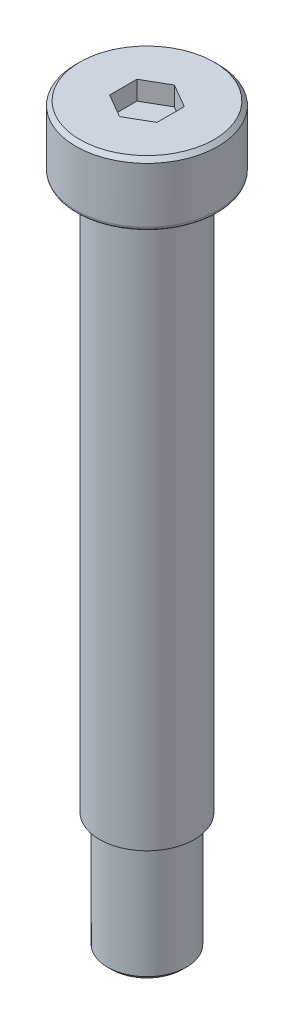
ISO-10303-21;
HEADER;
FILE_DESCRIPTION(('STEP AP214'),'2;1');
FILE_NAME('part.step','',(''),(''),'','','');
FILE_SCHEMA(('AUTOMOTIVE_DESIGN { 1 0 10303 214 1 1 1 1 }'));
ENDSEC;
DATA;
#1=APPLICATION_CONTEXT('core data for automotive mechanical design processes');
#2=APPLICATION_PROTOCOL_DEFINITION('international standard','automotive_design',2000,#1);
#3=PRODUCT_CONTEXT('',#1,'mechanical');
#4=PRODUCT('Part','Part','',(#3));
#5=PRODUCT_RELATED_PRODUCT_CATEGORY('part','',(#4));
#6=PRODUCT_DEFINITION_FORMATION('','',#4);
#7=PRODUCT_DEFINITION_CONTEXT('part definition',#1,'design');
#8=PRODUCT_DEFINITION('design','',#6,#7);
#9=PRODUCT_DEFINITION_SHAPE('','',#8);
#10=(LENGTH_UNIT() NAMED_UNIT(*) SI_UNIT(.MILLI.,.METRE.));
#11=(NAMED_UNIT(*) PLANE_ANGLE_UNIT() SI_UNIT($,.RADIAN.));
#12=(NAMED_UNIT(*) SI_UNIT($,.STERADIAN.) SOLID_ANGLE_UNIT());
#13=UNCERTAINTY_MEASURE_WITH_UNIT(LENGTH_MEASURE(1.E-05),#10,'distance_accuracy_value','');
#14=(GEOMETRIC_REPRESENTATION_CONTEXT(3) GLOBAL_UNCERTAINTY_ASSIGNED_CONTEXT((#13)) GLOBAL_UNIT_ASSIGNED_CONTEXT((#10,
#11,#12)) REPRESENTATION_CONTEXT('',''));
#15=CARTESIAN_POINT('',(0.,0.,0.));
#16=DIRECTION('',(0.,0.,1.));
#17=DIRECTION('',(1.,0.,0.));
#18=AXIS2_PLACEMENT_3D('',#15,#16,#17);
#19=CARTESIAN_POINT('',(0.,0.,0.));
#20=DIRECTION('',(0.,-1.,0.));
#21=DIRECTION('',(1.,0.,0.));
#22=AXIS2_PLACEMENT_3D('',#19,#20,#21);
#23=PLANE('',#22);
#24=CARTESIAN_POINT('',(0.,0.,0.));
#25=DIRECTION('',(0.,-1.,0.));
#26=DIRECTION('',(1.,0.,0.));
#27=AXIS2_PLACEMENT_3D('',#24,#25,#26);
#28=CIRCLE('',#27,8.49999999999999);
#29=CARTESIAN_POINT('',(8.49999999999999,0.,0.));
#30=VERTEX_POINT('',#29);
#31=EDGE_CURVE('E166',#30,#30,#28,.F.);
#32=ORIENTED_EDGE('',*,*,#31,.T.);
#33=EDGE_LOOP('',(#32));
#34=FACE_BOUND('',#33,.T.);
#35=DIRECTION('',(0.866025403784439,0.,-0.5));
#36=VECTOR('',#35,1.);
#37=CARTESIAN_POINT('',(0.,0.,3.46410161513776));
#38=LINE('',#37,#36);
#39=CARTESIAN_POINT('',(0.,0.,3.46410161513776));
#40=VERTEX_POINT('',#39);
#41=CARTESIAN_POINT('',(3.,0.,1.73205080756888));
#42=VERTEX_POINT('',#41);
#43=EDGE_CURVE('E133',#40,#42,#38,.T.);
#44=ORIENTED_EDGE('',*,*,#43,.F.);
#45=DIRECTION('',(0.866025403784439,0.,0.5));
#46=VECTOR('',#45,1.);
#47=CARTESIAN_POINT('',(-3.,0.,1.73205080756888));
#48=LINE('',#47,#46);
#49=CARTESIAN_POINT('',(-3.,0.,1.73205080756888));
#50=VERTEX_POINT('',#49);
#51=EDGE_CURVE('E59',#50,#40,#48,.T.);
#52=ORIENTED_EDGE('',*,*,#51,.F.);
#53=DIRECTION('',(0.,0.,1.));
#54=VECTOR('',#53,1.);
#55=CARTESIAN_POINT('',(-3.,0.,-1.73205080756888));
#56=LINE('',#55,#54);
#57=CARTESIAN_POINT('',(-3.,0.,-1.73205080756888));
#58=VERTEX_POINT('',#57);
#59=EDGE_CURVE('E142',#58,#50,#56,.T.);
#60=ORIENTED_EDGE('',*,*,#59,.F.);
#61=DIRECTION('',(-0.866025403784439,0.,0.5));
#62=VECTOR('',#61,1.);
#63=CARTESIAN_POINT('',(0.,0.,-3.46410161513775));
#64=LINE('',#63,#62);
#65=CARTESIAN_POINT('',(0.,0.,-3.46410161513775));
#66=VERTEX_POINT('',#65);
#67=EDGE_CURVE('E140',#66,#58,#64,.T.);
#68=ORIENTED_EDGE('',*,*,#67,.F.);
#69=DIRECTION('',(-0.866025403784439,0.,-0.5));
#70=VECTOR('',#69,1.);
#71=CARTESIAN_POINT('',(3.,0.,-1.73205080756888));
#72=LINE('',#71,#70);
#73=CARTESIAN_POINT('',(3.,0.,-1.73205080756888));
#74=VERTEX_POINT('',#73);
#75=EDGE_CURVE('E107',#74,#66,#72,.T.);
#76=ORIENTED_EDGE('',*,*,#75,.F.);
#77=DIRECTION('',(0.,0.,-1.));
#78=VECTOR('',#77,1.);
#79=CARTESIAN_POINT('',(3.,0.,1.73205080756888));
#80=LINE('',#79,#78);
#81=EDGE_CURVE('E136',#42,#74,#80,.T.);
#82=ORIENTED_EDGE('',*,*,#81,.F.);
#83=EDGE_LOOP('',(#44,#52,#60,#68,#76,#82));
#84=FACE_BOUND('',#83,.T.);
#85=ADVANCED_FACE('F43',(#34,#84),#23,.F.);
#86=CARTESIAN_POINT('',(0.,5.,0.));
#87=DIRECTION('',(0.,1.,0.));
#88=DIRECTION('',(-1.,0.,0.));
#89=AXIS2_PLACEMENT_3D('',#86,#87,#88);
#90=CYLINDRICAL_SURFACE('',#89,9.);
#91=CARTESIAN_POINT('',(0.,-7.50000000000001,0.));
#92=DIRECTION('',(0.,1.,0.));
#93=DIRECTION('',(-1.,0.,0.));
#94=AXIS2_PLACEMENT_3D('',#91,#92,#93);
#95=CIRCLE('',#94,9.);
#96=CARTESIAN_POINT('',(-9.,-7.50000000000001,0.));
#97=VERTEX_POINT('',#96);
#98=EDGE_CURVE('E172',#97,#97,#95,.T.);
#99=ORIENTED_EDGE('',*,*,#98,.T.);
#100=EDGE_LOOP('',(#99));
#101=FACE_BOUND('',#100,.T.);
#102=CARTESIAN_POINT('',(0.,-0.500000000000024,0.));
#103=DIRECTION('',(0.,-1.,0.));
#104=DIRECTION('',(1.,0.,0.));
#105=AXIS2_PLACEMENT_3D('',#102,#103,#104);
#106=CIRCLE('',#105,9.);
#107=CARTESIAN_POINT('',(9.,-0.500000000000023,0.));
#108=VERTEX_POINT('',#107);
#109=EDGE_CURVE('E169',#108,#108,#106,.T.);
#110=ORIENTED_EDGE('',*,*,#109,.T.);
#111=EDGE_LOOP('',(#110));
#112=FACE_BOUND('',#111,.T.);
#113=ADVANCED_FACE('F194',(#101,#112),#90,.T.);
#114=CARTESIAN_POINT('',(9.,-8.,0.));
#115=DIRECTION('',(0.,1.,0.));
#116=DIRECTION('',(-1.,0.,0.));
#117=AXIS2_PLACEMENT_3D('',#114,#115,#116);
#118=PLANE('',#117);
#119=CARTESIAN_POINT('',(0.,-8.00000000000001,0.));
#120=DIRECTION('',(0.,1.,0.));
#121=DIRECTION('',(-1.,0.,0.));
#122=AXIS2_PLACEMENT_3D('',#119,#120,#121);
#123=CIRCLE('',#122,8.5);
#124=CARTESIAN_POINT('',(-8.49999999999999,-8.00000000000001,0.));
#125=VERTEX_POINT('',#124);
#126=EDGE_CURVE('E175',#125,#125,#123,.F.);
#127=ORIENTED_EDGE('',*,*,#126,.T.);
#128=EDGE_LOOP('',(#127));
#129=FACE_BOUND('',#128,.T.);
#130=CARTESIAN_POINT('',(0.,-8.,0.));
#131=DIRECTION('',(0.,1.,0.));
#132=DIRECTION('',(-1.,0.,0.));
#133=AXIS2_PLACEMENT_3D('',#130,#131,#132);
#134=CIRCLE('',#133,5.75);
#135=CARTESIAN_POINT('',(-5.75,-8.,0.));
#136=VERTEX_POINT('',#135);
#137=EDGE_CURVE('E163',#136,#136,#134,.T.);
#138=ORIENTED_EDGE('',*,*,#137,.T.);
#139=EDGE_LOOP('',(#138));
#140=FACE_BOUND('',#139,.T.);
#141=ADVANCED_FACE('F202',(#129,#140),#118,.F.);
#142=CARTESIAN_POINT('',(0.,5.,0.));
#143=DIRECTION('',(0.,1.,0.));
#144=DIRECTION('',(-1.,0.,0.));
#145=AXIS2_PLACEMENT_3D('',#142,#143,#144);
#146=CYLINDRICAL_SURFACE('',#145,5.75);
#147=ORIENTED_EDGE('',*,*,#137,.F.);
#148=EDGE_LOOP('',(#147));
#149=FACE_BOUND('',#148,.T.);
#150=CARTESIAN_POINT('',(0.,-8.5,0.));
#151=DIRECTION('',(0.,1.,0.));
#152=DIRECTION('',(-1.,0.,0.));
#153=AXIS2_PLACEMENT_3D('',#150,#151,#152);
#154=CIRCLE('',#153,5.75);
#155=CARTESIAN_POINT('',(-5.75,-8.5,0.));
#156=VERTEX_POINT('',#155);
#157=EDGE_CURVE('E160',#156,#156,#154,.T.);
#158=ORIENTED_EDGE('',*,*,#157,.T.);
#159=EDGE_LOOP('',(#158));
#160=FACE_BOUND('',#159,.T.);
#161=ADVANCED_FACE('F256',(#149,#160),#146,.T.);
#162=CARTESIAN_POINT('',(5.75,-8.5,0.));
#163=DIRECTION('',(0.,-1.,0.));
#164=DIRECTION('',(1.,0.,0.));
#165=AXIS2_PLACEMENT_3D('',#162,#163,#164);
#166=PLANE('',#165);
#167=ORIENTED_EDGE('',*,*,#157,.F.);
#168=EDGE_LOOP('',(#167));
#169=FACE_BOUND('',#168,.T.);
#170=CARTESIAN_POINT('',(0.,-8.5,0.));
#171=DIRECTION('',(0.,1.,0.));
#172=DIRECTION('',(-1.,0.,0.));
#173=AXIS2_PLACEMENT_3D('',#170,#171,#172);
#174=CIRCLE('',#173,6.);
#175=CARTESIAN_POINT('',(-6.,-8.5,0.));
#176=VERTEX_POINT('',#175);
#177=EDGE_CURVE('E157',#176,#176,#174,.T.);
#178=ORIENTED_EDGE('',*,*,#177,.T.);
#179=EDGE_LOOP('',(#178));
#180=FACE_BOUND('',#179,.T.);
#181=ADVANCED_FACE('F252',(#169,#180),#166,.F.);
#182=CARTESIAN_POINT('',(0.,5.,0.));
#183=DIRECTION('',(0.,1.,0.));
#184=DIRECTION('',(-1.,0.,0.));
#185=AXIS2_PLACEMENT_3D('',#182,#183,#184);
#186=CYLINDRICAL_SURFACE('',#185,6.00000000000001);
#187=ORIENTED_EDGE('',*,*,#177,.F.);
#188=EDGE_LOOP('',(#187));
#189=FACE_BOUND('',#188,.T.);
#190=CARTESIAN_POINT('',(0.,-78.,0.));
#191=DIRECTION('',(0.,1.,0.));
#192=DIRECTION('',(-1.,0.,0.));
#193=AXIS2_PLACEMENT_3D('',#190,#191,#192);
#194=CIRCLE('',#193,6.00000000000001);
#195=CARTESIAN_POINT('',(-6.,-78.,0.));
#196=VERTEX_POINT('',#195);
#197=EDGE_CURVE('E154',#196,#196,#194,.T.);
#198=ORIENTED_EDGE('',*,*,#197,.T.);
#199=EDGE_LOOP('',(#198));
#200=FACE_BOUND('',#199,.T.);
#201=ADVANCED_FACE('F248',(#189,#200),#186,.T.);
#202=CARTESIAN_POINT('',(6.00000000000002,-78.,0.));
#203=DIRECTION('',(0.,1.,0.));
#204=DIRECTION('',(-1.,0.,0.));
#205=AXIS2_PLACEMENT_3D('',#202,#203,#204);
#206=PLANE('',#205);
#207=ORIENTED_EDGE('',*,*,#197,.F.);
#208=EDGE_LOOP('',(#207));
#209=FACE_BOUND('',#208,.T.);
#210=CARTESIAN_POINT('',(0.,-78.,0.));
#211=DIRECTION('',(0.,1.,0.));
#212=DIRECTION('',(-1.,0.,0.));
#213=AXIS2_PLACEMENT_3D('',#210,#211,#212);
#214=CIRCLE('',#213,5.);
#215=CARTESIAN_POINT('',(-4.99999999999999,-78.,0.));
#216=VERTEX_POINT('',#215);
#217=EDGE_CURVE('E146',#216,#216,#214,.T.);
#218=ORIENTED_EDGE('',*,*,#217,.T.);
#219=EDGE_LOOP('',(#218));
#220=FACE_BOUND('',#219,.T.);
#221=ADVANCED_FACE('F245',(#209,#220),#206,.F.);
#222=CARTESIAN_POINT('',(0.,5.,0.));
#223=DIRECTION('',(0.,1.,0.));
#224=DIRECTION('',(-1.,0.,0.));
#225=AXIS2_PLACEMENT_3D('',#222,#223,#224);
#226=CYLINDRICAL_SURFACE('',#225,5.);
#227=CARTESIAN_POINT('',(0.,-92.5,0.));
#228=DIRECTION('',(0.,1.,0.));
#229=DIRECTION('',(-1.,0.,0.));
#230=AXIS2_PLACEMENT_3D('',#227,#228,#229);
#231=CIRCLE('',#230,5.);
#232=CARTESIAN_POINT('',(-4.99999999999999,-92.5,0.));
#233=VERTEX_POINT('',#232);
#234=EDGE_CURVE('E52',#233,#233,#231,.T.);
#235=ORIENTED_EDGE('',*,*,#234,.T.);
#236=EDGE_LOOP('',(#235));
#237=FACE_BOUND('',#236,.T.);
#238=ORIENTED_EDGE('',*,*,#217,.F.);
#239=EDGE_LOOP('',(#238));
#240=FACE_BOUND('',#239,.T.);
#241=ADVANCED_FACE('F180',(#237,#240),#226,.T.);
#242=CARTESIAN_POINT('',(5.00000000000001,-93.,0.));
#243=DIRECTION('',(0.,1.,0.));
#244=DIRECTION('',(-1.,0.,0.));
#245=AXIS2_PLACEMENT_3D('',#242,#243,#244);
#246=PLANE('',#245);
#247=CARTESIAN_POINT('',(0.,-93.,0.));
#248=DIRECTION('',(0.,1.,0.));
#249=DIRECTION('',(-1.,0.,0.));
#250=AXIS2_PLACEMENT_3D('',#247,#248,#249);
#251=CIRCLE('',#250,4.5);
#252=CARTESIAN_POINT('',(-4.49999999999999,-93.,0.));
#253=VERTEX_POINT('',#252);
#254=EDGE_CURVE('E11',#253,#253,#251,.F.);
#255=ORIENTED_EDGE('',*,*,#254,.T.);
#256=EDGE_LOOP('',(#255));
#257=FACE_BOUND('',#256,.T.);
#258=ADVANCED_FACE('F240',(#257),#246,.F.);
#259=CARTESIAN_POINT('',(-3.,-2.4,1.73205080756888));
#260=DIRECTION('',(-0.5,0.,0.866025403784439));
#261=DIRECTION('',(0.866025403784439,0.,0.5));
#262=AXIS2_PLACEMENT_3D('',#259,#260,#261);
#263=PLANE('',#262);
#264=ORIENTED_EDGE('',*,*,#51,.T.);
#265=DIRECTION('',(0.,1.,0.));
#266=VECTOR('',#265,1.);
#267=CARTESIAN_POINT('',(0.,-2.4,3.46410161513776));
#268=LINE('',#267,#266);
#269=CARTESIAN_POINT('',(0.,-2.4,3.46410161513776));
#270=VERTEX_POINT('',#269);
#271=EDGE_CURVE('E89',#270,#40,#268,.T.);
#272=ORIENTED_EDGE('',*,*,#271,.F.);
#273=DIRECTION('',(0.866025403784439,0.,0.5));
#274=VECTOR('',#273,1.);
#275=CARTESIAN_POINT('',(-3.,-2.4,1.73205080756888));
#276=LINE('',#275,#274);
#277=CARTESIAN_POINT('',(-3.,-2.4,1.73205080756888));
#278=VERTEX_POINT('',#277);
#279=EDGE_CURVE('E144',#278,#270,#276,.T.);
#280=ORIENTED_EDGE('',*,*,#279,.F.);
#281=DIRECTION('',(0.,1.,0.));
#282=VECTOR('',#281,1.);
#283=CARTESIAN_POINT('',(-3.,-2.4,1.73205080756888));
#284=LINE('',#283,#282);
#285=EDGE_CURVE('E67',#278,#50,#284,.T.);
#286=ORIENTED_EDGE('',*,*,#285,.T.);
#287=EDGE_LOOP('',(#264,#272,#280,#286));
#288=FACE_BOUND('',#287,.T.);
#289=ADVANCED_FACE('F230',(#288),#263,.F.);
#290=CARTESIAN_POINT('',(-3.,-2.4,-1.73205080756888));
#291=DIRECTION('',(-1.,0.,0.));
#292=DIRECTION('',(0.,-1.,0.));
#293=AXIS2_PLACEMENT_3D('',#290,#291,#292);
#294=PLANE('',#293);
#295=ORIENTED_EDGE('',*,*,#59,.T.);
#296=ORIENTED_EDGE('',*,*,#285,.F.);
#297=DIRECTION('',(0.,0.,1.));
#298=VECTOR('',#297,1.);
#299=CARTESIAN_POINT('',(-3.,-2.4,-1.73205080756888));
#300=LINE('',#299,#298);
#301=CARTESIAN_POINT('',(-3.,-2.4,-1.73205080756888));
#302=VERTEX_POINT('',#301);
#303=EDGE_CURVE('E119',#302,#278,#300,.T.);
#304=ORIENTED_EDGE('',*,*,#303,.F.);
#305=DIRECTION('',(0.,1.,0.));
#306=VECTOR('',#305,1.);
#307=CARTESIAN_POINT('',(-3.,-2.4,-1.73205080756888));
#308=LINE('',#307,#306);
#309=EDGE_CURVE('E111',#302,#58,#308,.T.);
#310=ORIENTED_EDGE('',*,*,#309,.T.);
#311=EDGE_LOOP('',(#295,#296,#304,#310));
#312=FACE_BOUND('',#311,.T.);
#313=ADVANCED_FACE('F227',(#312),#294,.F.);
#314=CARTESIAN_POINT('',(0.,-2.4,-3.46410161513775));
#315=DIRECTION('',(-0.5,0.,-0.866025403784439));
#316=DIRECTION('',(-0.866025403784439,0.,0.5));
#317=AXIS2_PLACEMENT_3D('',#314,#315,#316);
#318=PLANE('',#317);
#319=ORIENTED_EDGE('',*,*,#67,.T.);
#320=ORIENTED_EDGE('',*,*,#309,.F.);
#321=DIRECTION('',(-0.866025403784439,0.,0.5));
#322=VECTOR('',#321,1.);
#323=CARTESIAN_POINT('',(0.,-2.4,-3.46410161513775));
#324=LINE('',#323,#322);
#325=CARTESIAN_POINT('',(0.,-2.4,-3.46410161513775));
#326=VERTEX_POINT('',#325);
#327=EDGE_CURVE('E115',#326,#302,#324,.T.);
#328=ORIENTED_EDGE('',*,*,#327,.F.);
#329=DIRECTION('',(0.,1.,0.));
#330=VECTOR('',#329,1.);
#331=CARTESIAN_POINT('',(0.,-2.4,-3.46410161513775));
#332=LINE('',#331,#330);
#333=EDGE_CURVE('E100',#326,#66,#332,.T.);
#334=ORIENTED_EDGE('',*,*,#333,.T.);
#335=EDGE_LOOP('',(#319,#320,#328,#334));
#336=FACE_BOUND('',#335,.T.);
#337=ADVANCED_FACE('F116',(#336),#318,.F.);
#338=CARTESIAN_POINT('',(3.,-2.4,-1.73205080756888));
#339=DIRECTION('',(0.5,0.,-0.866025403784439));
#340=DIRECTION('',(-0.866025403784439,0.,-0.5));
#341=AXIS2_PLACEMENT_3D('',#338,#339,#340);
#342=PLANE('',#341);
#343=ORIENTED_EDGE('',*,*,#75,.T.);
#344=ORIENTED_EDGE('',*,*,#333,.F.);
#345=DIRECTION('',(-0.866025403784439,0.,-0.5));
#346=VECTOR('',#345,1.);
#347=CARTESIAN_POINT('',(3.,-2.4,-1.73205080756888));
#348=LINE('',#347,#346);
#349=CARTESIAN_POINT('',(3.,-2.4,-1.73205080756888));
#350=VERTEX_POINT('',#349);
#351=EDGE_CURVE('E104',#350,#326,#348,.T.);
#352=ORIENTED_EDGE('',*,*,#351,.F.);
#353=DIRECTION('',(0.,1.,0.));
#354=VECTOR('',#353,1.);
#355=CARTESIAN_POINT('',(3.,-2.4,-1.73205080756888));
#356=LINE('',#355,#354);
#357=EDGE_CURVE('E112',#350,#74,#356,.T.);
#358=ORIENTED_EDGE('',*,*,#357,.T.);
#359=EDGE_LOOP('',(#343,#344,#352,#358));
#360=FACE_BOUND('',#359,.T.);
#361=ADVANCED_FACE('F102',(#360),#342,.F.);
#362=CARTESIAN_POINT('',(3.,-2.4,1.73205080756888));
#363=DIRECTION('',(1.,0.,0.));
#364=DIRECTION('',(0.,0.,-1.));
#365=AXIS2_PLACEMENT_3D('',#362,#363,#364);
#366=PLANE('',#365);
#367=ORIENTED_EDGE('',*,*,#81,.T.);
#368=ORIENTED_EDGE('',*,*,#357,.F.);
#369=DIRECTION('',(0.,0.,-1.));
#370=VECTOR('',#369,1.);
#371=CARTESIAN_POINT('',(3.,-2.4,1.73205080756888));
#372=LINE('',#371,#370);
#373=CARTESIAN_POINT('',(3.,-2.4,1.73205080756888));
#374=VERTEX_POINT('',#373);
#375=EDGE_CURVE('E125',#374,#350,#372,.T.);
#376=ORIENTED_EDGE('',*,*,#375,.F.);
#377=DIRECTION('',(0.,1.,0.));
#378=VECTOR('',#377,1.);
#379=CARTESIAN_POINT('',(3.,-2.4,1.73205080756888));
#380=LINE('',#379,#378);
#381=EDGE_CURVE('E149',#374,#42,#380,.T.);
#382=ORIENTED_EDGE('',*,*,#381,.T.);
#383=EDGE_LOOP('',(#367,#368,#376,#382));
#384=FACE_BOUND('',#383,.T.);
#385=ADVANCED_FACE('F223',(#384),#366,.F.);
#386=CARTESIAN_POINT('',(0.,-2.4,3.46410161513776));
#387=DIRECTION('',(0.5,0.,0.866025403784439));
#388=DIRECTION('',(0.866025403784439,0.,-0.5));
#389=AXIS2_PLACEMENT_3D('',#386,#387,#388);
#390=PLANE('',#389);
#391=ORIENTED_EDGE('',*,*,#43,.T.);
#392=ORIENTED_EDGE('',*,*,#381,.F.);
#393=DIRECTION('',(0.866025403784439,0.,-0.5));
#394=VECTOR('',#393,1.);
#395=CARTESIAN_POINT('',(0.,-2.4,3.46410161513776));
#396=LINE('',#395,#394);
#397=EDGE_CURVE('E127',#270,#374,#396,.T.);
#398=ORIENTED_EDGE('',*,*,#397,.F.);
#399=ORIENTED_EDGE('',*,*,#271,.T.);
#400=EDGE_LOOP('',(#391,#392,#398,#399));
#401=FACE_BOUND('',#400,.T.);
#402=ADVANCED_FACE('F214',(#401),#390,.F.);
#403=CARTESIAN_POINT('',(0.,-2.4,0.));
#404=DIRECTION('',(0.,1.,0.));
#405=DIRECTION('',(-1.,0.,0.));
#406=AXIS2_PLACEMENT_3D('',#403,#404,#405);
#407=PLANE('',#406);
#408=ORIENTED_EDGE('',*,*,#279,.T.);
#409=ORIENTED_EDGE('',*,*,#397,.T.);
#410=ORIENTED_EDGE('',*,*,#375,.T.);
#411=ORIENTED_EDGE('',*,*,#351,.T.);
#412=ORIENTED_EDGE('',*,*,#327,.T.);
#413=ORIENTED_EDGE('',*,*,#303,.T.);
#414=EDGE_LOOP('',(#408,#409,#410,#411,#412,#413));
#415=FACE_BOUND('',#414,.T.);
#416=ADVANCED_FACE('F122',(#415),#407,.T.);
#417=CARTESIAN_POINT('',(0.,0.,0.));
#418=DIRECTION('',(0.,-1.,0.));
#419=DIRECTION('',(1.,0.,0.));
#420=AXIS2_PLACEMENT_3D('',#417,#418,#419);
#421=CONICAL_SURFACE('',#420,8.49999999999999,0.785398163397433);
#422=ORIENTED_EDGE('',*,*,#109,.F.);
#423=EDGE_LOOP('',(#422));
#424=FACE_BOUND('',#423,.T.);
#425=ORIENTED_EDGE('',*,*,#31,.F.);
#426=EDGE_LOOP('',(#425));
#427=FACE_BOUND('',#426,.T.);
#428=ADVANCED_FACE('F190',(#424,#427),#421,.T.);
#429=CARTESIAN_POINT('',(0.,-7.50000000000001,0.));
#430=DIRECTION('',(0.,1.,0.));
#431=DIRECTION('',(-1.,0.,0.));
#432=AXIS2_PLACEMENT_3D('',#429,#430,#431);
#433=TOROIDAL_SURFACE('',#432,8.5,0.5);
#434=ORIENTED_EDGE('',*,*,#126,.F.);
#435=EDGE_LOOP('',(#434));
#436=FACE_BOUND('',#435,.T.);
#437=ORIENTED_EDGE('',*,*,#98,.F.);
#438=EDGE_LOOP('',(#437));
#439=FACE_BOUND('',#438,.T.);
#440=ADVANCED_FACE('F184',(#436,#439),#433,.T.);
#441=CARTESIAN_POINT('',(0.,-92.5,0.));
#442=DIRECTION('',(0.,1.,0.));
#443=DIRECTION('',(-1.,0.,0.));
#444=AXIS2_PLACEMENT_3D('',#441,#442,#443);
#445=CONICAL_SURFACE('',#444,5.,0.785398163397444);
#446=ORIENTED_EDGE('',*,*,#254,.F.);
#447=EDGE_LOOP('',(#446));
#448=FACE_BOUND('',#447,.T.);
#449=ORIENTED_EDGE('',*,*,#234,.F.);
#450=EDGE_LOOP('',(#449));
#451=FACE_BOUND('',#450,.T.);
#452=ADVANCED_FACE('F46',(#448,#451),#445,.T.);
#453=CLOSED_SHELL('',(#85,#113,#141,#161,#181,#201,#221,#241,#258,#289,#313,#337,#361,#385,#402,
#416,#428,#440,#452));
#454=MANIFOLD_SOLID_BREP('B2',#453);
#455=ADVANCED_BREP_SHAPE_REPRESENTATION('',(#18,#454),#14);
#456=SHAPE_DEFINITION_REPRESENTATION(#9,#455);
ENDSEC;
END-ISO-10303-21;
